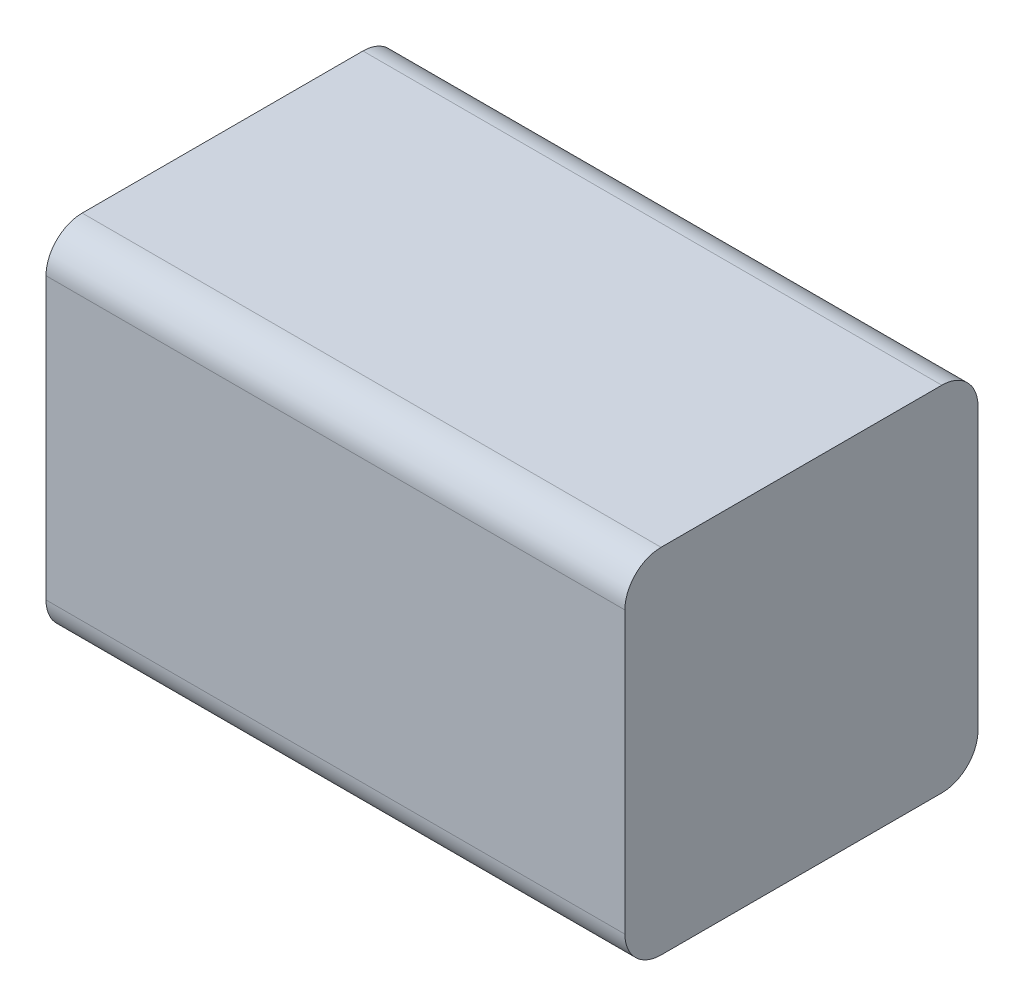
ISO-10303-21;
HEADER;
FILE_DESCRIPTION(('STEP AP214'),'2;1');
FILE_NAME('part.step','',(''),(''),'','','');
FILE_SCHEMA(('AUTOMOTIVE_DESIGN { 1 0 10303 214 1 1 1 1 }'));
ENDSEC;
DATA;
#1=APPLICATION_CONTEXT('core data for automotive mechanical design processes');
#2=APPLICATION_PROTOCOL_DEFINITION('international standard','automotive_design',2000,#1);
#3=PRODUCT_CONTEXT('',#1,'mechanical');
#4=PRODUCT('Part','Part','',(#3));
#5=PRODUCT_RELATED_PRODUCT_CATEGORY('part','',(#4));
#6=PRODUCT_DEFINITION_FORMATION('','',#4);
#7=PRODUCT_DEFINITION_CONTEXT('part definition',#1,'design');
#8=PRODUCT_DEFINITION('design','',#6,#7);
#9=PRODUCT_DEFINITION_SHAPE('','',#8);
#10=(LENGTH_UNIT() NAMED_UNIT(*) SI_UNIT(.MILLI.,.METRE.));
#11=(NAMED_UNIT(*) PLANE_ANGLE_UNIT() SI_UNIT($,.RADIAN.));
#12=(NAMED_UNIT(*) SI_UNIT($,.STERADIAN.) SOLID_ANGLE_UNIT());
#13=UNCERTAINTY_MEASURE_WITH_UNIT(LENGTH_MEASURE(1.E-05),#10,'distance_accuracy_value','');
#14=(GEOMETRIC_REPRESENTATION_CONTEXT(3) GLOBAL_UNCERTAINTY_ASSIGNED_CONTEXT((#13)) GLOBAL_UNIT_ASSIGNED_CONTEXT((#10,
#11,#12)) REPRESENTATION_CONTEXT('',''));
#15=CARTESIAN_POINT('',(0.,0.,0.));
#16=DIRECTION('',(0.,0.,1.));
#17=DIRECTION('',(1.,0.,0.));
#18=AXIS2_PLACEMENT_3D('',#15,#16,#17);
#19=CARTESIAN_POINT('',(-0.4,-0.194,0.458));
#20=DIRECTION('',(-1.,0.,0.));
#21=DIRECTION('',(0.,1.,0.));
#22=AXIS2_PLACEMENT_3D('',#19,#20,#21);
#23=CYLINDRICAL_SURFACE('',#22,0.05);
#24=CARTESIAN_POINT('',(-0.4,-0.194,0.458));
#25=DIRECTION('',(1.,0.,0.));
#26=DIRECTION('',(0.,1.,0.));
#27=AXIS2_PLACEMENT_3D('',#24,#25,#26);
#28=CIRCLE('',#27,0.05);
#29=CARTESIAN_POINT('',(-0.4,-0.19400000043,0.508));
#30=VERTEX_POINT('',#29);
#31=CARTESIAN_POINT('',(-0.4,-0.244,0.458));
#32=VERTEX_POINT('',#31);
#33=EDGE_CURVE('E141',#30,#32,#28,.T.);
#34=ORIENTED_EDGE('',*,*,#33,.T.);
#35=DIRECTION('',(1.,0.,0.));
#36=VECTOR('',#35,1.);
#37=CARTESIAN_POINT('',(-0.4,-0.244,0.458));
#38=LINE('',#37,#36);
#39=CARTESIAN_POINT('',(0.4,-0.244,0.458));
#40=VERTEX_POINT('',#39);
#41=EDGE_CURVE('E11',#32,#40,#38,.T.);
#42=ORIENTED_EDGE('',*,*,#41,.T.);
#43=CARTESIAN_POINT('',(0.4,-0.194,0.458));
#44=DIRECTION('',(1.,0.,0.));
#45=DIRECTION('',(0.,1.,0.));
#46=AXIS2_PLACEMENT_3D('',#43,#44,#45);
#47=CIRCLE('',#46,0.05);
#48=CARTESIAN_POINT('',(0.4,-0.19400000043,0.508));
#49=VERTEX_POINT('',#48);
#50=EDGE_CURVE('E137',#49,#40,#47,.T.);
#51=ORIENTED_EDGE('',*,*,#50,.F.);
#52=DIRECTION('',(1.,0.,0.));
#53=VECTOR('',#52,1.);
#54=CARTESIAN_POINT('',(-0.4,-0.19400000043,0.508));
#55=LINE('',#54,#53);
#56=EDGE_CURVE('E143',#30,#49,#55,.T.);
#57=ORIENTED_EDGE('',*,*,#56,.F.);
#58=EDGE_LOOP('',(#34,#42,#51,#57));
#59=FACE_BOUND('',#58,.T.);
#60=ADVANCED_FACE('F17',(#59),#23,.T.);
#61=CARTESIAN_POINT('',(-0.4,-0.244,0.458));
#62=DIRECTION('',(0.,1.,0.));
#63=DIRECTION('',(1.,0.,0.));
#64=AXIS2_PLACEMENT_3D('',#61,#62,#63);
#65=PLANE('',#64);
#66=DIRECTION('',(0.,0.,-1.));
#67=VECTOR('',#66,1.);
#68=CARTESIAN_POINT('',(-0.4,-0.244,0.458));
#69=LINE('',#68,#67);
#70=CARTESIAN_POINT('',(-0.4,-0.244,0.07));
#71=VERTEX_POINT('',#70);
#72=EDGE_CURVE('E144',#32,#71,#69,.T.);
#73=ORIENTED_EDGE('',*,*,#72,.T.);
#74=DIRECTION('',(1.,0.,0.));
#75=VECTOR('',#74,1.);
#76=CARTESIAN_POINT('',(-0.4,-0.244,0.07));
#77=LINE('',#76,#75);
#78=CARTESIAN_POINT('',(0.4,-0.244,0.07));
#79=VERTEX_POINT('',#78);
#80=EDGE_CURVE('E28',#71,#79,#77,.T.);
#81=ORIENTED_EDGE('',*,*,#80,.T.);
#82=DIRECTION('',(0.,0.,-1.));
#83=VECTOR('',#82,1.);
#84=CARTESIAN_POINT('',(0.4,-0.244,0.458));
#85=LINE('',#84,#83);
#86=EDGE_CURVE('E132',#40,#79,#85,.T.);
#87=ORIENTED_EDGE('',*,*,#86,.F.);
#88=ORIENTED_EDGE('',*,*,#41,.F.);
#89=EDGE_LOOP('',(#73,#81,#87,#88));
#90=FACE_BOUND('',#89,.T.);
#91=ADVANCED_FACE('F219',(#90),#65,.F.);
#92=CARTESIAN_POINT('',(-0.4,-0.194,0.07));
#93=DIRECTION('',(-1.,0.,0.));
#94=DIRECTION('',(0.,1.,0.));
#95=AXIS2_PLACEMENT_3D('',#92,#93,#94);
#96=CYLINDRICAL_SURFACE('',#95,0.05);
#97=CARTESIAN_POINT('',(-0.4,-0.194,0.07));
#98=DIRECTION('',(1.,0.,0.));
#99=DIRECTION('',(0.,1.,0.));
#100=AXIS2_PLACEMENT_3D('',#97,#98,#99);
#101=CIRCLE('',#100,0.05);
#102=CARTESIAN_POINT('',(-0.4,-0.19400000043,0.02));
#103=VERTEX_POINT('',#102);
#104=EDGE_CURVE('E21',#71,#103,#101,.T.);
#105=ORIENTED_EDGE('',*,*,#104,.T.);
#106=DIRECTION('',(1.,0.,0.));
#107=VECTOR('',#106,1.);
#108=CARTESIAN_POINT('',(-0.4,-0.19400000043,0.02));
#109=LINE('',#108,#107);
#110=CARTESIAN_POINT('',(0.4,-0.19400000043,0.02));
#111=VERTEX_POINT('',#110);
#112=EDGE_CURVE('E126',#103,#111,#109,.T.);
#113=ORIENTED_EDGE('',*,*,#112,.T.);
#114=CARTESIAN_POINT('',(0.4,-0.194,0.07));
#115=DIRECTION('',(1.,0.,0.));
#116=DIRECTION('',(0.,1.,0.));
#117=AXIS2_PLACEMENT_3D('',#114,#115,#116);
#118=CIRCLE('',#117,0.05);
#119=EDGE_CURVE('E136',#79,#111,#118,.T.);
#120=ORIENTED_EDGE('',*,*,#119,.F.);
#121=ORIENTED_EDGE('',*,*,#80,.F.);
#122=EDGE_LOOP('',(#105,#113,#120,#121));
#123=FACE_BOUND('',#122,.T.);
#124=ADVANCED_FACE('F223',(#123),#96,.T.);
#125=CARTESIAN_POINT('',(-0.4,0.19400000048,0.02));
#126=DIRECTION('',(0.,0.,-1.));
#127=DIRECTION('',(0.,-1.,0.));
#128=AXIS2_PLACEMENT_3D('',#125,#126,#127);
#129=PLANE('',#128);
#130=DIRECTION('',(1.,0.,0.));
#131=VECTOR('',#130,1.);
#132=CARTESIAN_POINT('',(-0.4,0.19400000048,0.02));
#133=LINE('',#132,#131);
#134=CARTESIAN_POINT('',(-0.4,0.19400000048,0.02));
#135=VERTEX_POINT('',#134);
#136=CARTESIAN_POINT('',(0.4,0.19400000048,0.02));
#137=VERTEX_POINT('',#136);
#138=EDGE_CURVE('E129',#135,#137,#133,.T.);
#139=ORIENTED_EDGE('',*,*,#138,.T.);
#140=DIRECTION('',(0.,-1.,0.));
#141=VECTOR('',#140,1.);
#142=CARTESIAN_POINT('',(0.4,0.19400000048,0.02));
#143=LINE('',#142,#141);
#144=EDGE_CURVE('E150',#137,#111,#143,.T.);
#145=ORIENTED_EDGE('',*,*,#144,.T.);
#146=ORIENTED_EDGE('',*,*,#112,.F.);
#147=DIRECTION('',(0.,-1.,0.));
#148=VECTOR('',#147,1.);
#149=CARTESIAN_POINT('',(-0.4,0.19400000048,0.02));
#150=LINE('',#149,#148);
#151=EDGE_CURVE('E165',#135,#103,#150,.T.);
#152=ORIENTED_EDGE('',*,*,#151,.F.);
#153=EDGE_LOOP('',(#139,#145,#146,#152));
#154=FACE_BOUND('',#153,.T.);
#155=ADVANCED_FACE('F193',(#154),#129,.T.);
#156=CARTESIAN_POINT('',(-0.4,0.19400000048,0.07));
#157=DIRECTION('',(-1.,0.,0.));
#158=DIRECTION('',(0.,1.,0.));
#159=AXIS2_PLACEMENT_3D('',#156,#157,#158);
#160=CYLINDRICAL_SURFACE('',#159,0.05);
#161=CARTESIAN_POINT('',(-0.4,0.19400000048,0.07));
#162=DIRECTION('',(1.,0.,0.));
#163=DIRECTION('',(0.,1.,0.));
#164=AXIS2_PLACEMENT_3D('',#161,#162,#163);
#165=CIRCLE('',#164,0.05);
#166=CARTESIAN_POINT('',(-0.4,0.24400000048,0.07));
#167=VERTEX_POINT('',#166);
#168=EDGE_CURVE('E111',#135,#167,#165,.T.);
#169=ORIENTED_EDGE('',*,*,#168,.T.);
#170=DIRECTION('',(1.,0.,0.));
#171=VECTOR('',#170,1.);
#172=CARTESIAN_POINT('',(-0.4,0.24400000048,0.07));
#173=LINE('',#172,#171);
#174=CARTESIAN_POINT('',(0.4,0.24400000048,0.07));
#175=VERTEX_POINT('',#174);
#176=EDGE_CURVE('E102',#167,#175,#173,.T.);
#177=ORIENTED_EDGE('',*,*,#176,.T.);
#178=CARTESIAN_POINT('',(0.4,0.19400000048,0.07));
#179=DIRECTION('',(1.,0.,0.));
#180=DIRECTION('',(0.,1.,0.));
#181=AXIS2_PLACEMENT_3D('',#178,#179,#180);
#182=CIRCLE('',#181,0.05);
#183=EDGE_CURVE('E146',#137,#175,#182,.T.);
#184=ORIENTED_EDGE('',*,*,#183,.F.);
#185=ORIENTED_EDGE('',*,*,#138,.F.);
#186=EDGE_LOOP('',(#169,#177,#184,#185));
#187=FACE_BOUND('',#186,.T.);
#188=ADVANCED_FACE('F185',(#187),#160,.T.);
#189=CARTESIAN_POINT('',(-0.4,0.244,0.458));
#190=DIRECTION('',(0.,1.,1.2373066E-09));
#191=DIRECTION('',(0.999999999999937,0.,-3.55611131468928E-07));
#192=AXIS2_PLACEMENT_3D('',#189,#190,#191);
#193=PLANE('',#192);
#194=DIRECTION('',(1.,0.,0.));
#195=VECTOR('',#194,1.);
#196=CARTESIAN_POINT('',(-0.4,0.244,0.458));
#197=LINE('',#196,#195);
#198=CARTESIAN_POINT('',(-0.4,0.244,0.458));
#199=VERTEX_POINT('',#198);
#200=CARTESIAN_POINT('',(0.4,0.244,0.458));
#201=VERTEX_POINT('',#200);
#202=EDGE_CURVE('E90',#199,#201,#197,.T.);
#203=ORIENTED_EDGE('',*,*,#202,.T.);
#204=DIRECTION('',(0.,1.23730705E-09,-1.));
#205=VECTOR('',#204,1.);
#206=CARTESIAN_POINT('',(0.4,0.244,0.458));
#207=LINE('',#206,#205);
#208=EDGE_CURVE('E149',#201,#175,#207,.T.);
#209=ORIENTED_EDGE('',*,*,#208,.T.);
#210=ORIENTED_EDGE('',*,*,#176,.F.);
#211=DIRECTION('',(0.,1.23730705E-09,-1.));
#212=VECTOR('',#211,1.);
#213=CARTESIAN_POINT('',(-0.4,0.244,0.458));
#214=LINE('',#213,#212);
#215=EDGE_CURVE('E106',#199,#167,#214,.T.);
#216=ORIENTED_EDGE('',*,*,#215,.F.);
#217=EDGE_LOOP('',(#203,#209,#210,#216));
#218=FACE_BOUND('',#217,.T.);
#219=ADVANCED_FACE('F19',(#218),#193,.T.);
#220=CARTESIAN_POINT('',(-0.4,0.194,0.458));
#221=DIRECTION('',(-1.,0.,0.));
#222=DIRECTION('',(0.,1.,0.));
#223=AXIS2_PLACEMENT_3D('',#220,#221,#222);
#224=CYLINDRICAL_SURFACE('',#223,0.05);
#225=CARTESIAN_POINT('',(-0.4,0.194,0.458));
#226=DIRECTION('',(1.,0.,0.));
#227=DIRECTION('',(0.,1.,0.));
#228=AXIS2_PLACEMENT_3D('',#225,#226,#227);
#229=CIRCLE('',#228,0.05);
#230=CARTESIAN_POINT('',(-0.4,0.19400000048,0.508));
#231=VERTEX_POINT('',#230);
#232=EDGE_CURVE('E94',#199,#231,#229,.T.);
#233=ORIENTED_EDGE('',*,*,#232,.T.);
#234=DIRECTION('',(1.,0.,0.));
#235=VECTOR('',#234,1.);
#236=CARTESIAN_POINT('',(-0.4,0.19400000048,0.508));
#237=LINE('',#236,#235);
#238=CARTESIAN_POINT('',(0.4,0.19400000048,0.508));
#239=VERTEX_POINT('',#238);
#240=EDGE_CURVE('E103',#231,#239,#237,.T.);
#241=ORIENTED_EDGE('',*,*,#240,.T.);
#242=CARTESIAN_POINT('',(0.4,0.194,0.458));
#243=DIRECTION('',(1.,0.,0.));
#244=DIRECTION('',(0.,1.,0.));
#245=AXIS2_PLACEMENT_3D('',#242,#243,#244);
#246=CIRCLE('',#245,0.05);
#247=EDGE_CURVE('E97',#201,#239,#246,.T.);
#248=ORIENTED_EDGE('',*,*,#247,.F.);
#249=ORIENTED_EDGE('',*,*,#202,.F.);
#250=EDGE_LOOP('',(#233,#241,#248,#249));
#251=FACE_BOUND('',#250,.T.);
#252=ADVANCED_FACE('F92',(#251),#224,.T.);
#253=CARTESIAN_POINT('',(-0.4,-0.19400000043,0.508));
#254=DIRECTION('',(0.,0.,1.));
#255=DIRECTION('',(0.,-1.,0.));
#256=AXIS2_PLACEMENT_3D('',#253,#254,#255);
#257=PLANE('',#256);
#258=ORIENTED_EDGE('',*,*,#56,.T.);
#259=DIRECTION('',(0.,1.,0.));
#260=VECTOR('',#259,1.);
#261=CARTESIAN_POINT('',(0.4,-0.19400000043,0.508));
#262=LINE('',#261,#260);
#263=EDGE_CURVE('E123',#49,#239,#262,.T.);
#264=ORIENTED_EDGE('',*,*,#263,.T.);
#265=ORIENTED_EDGE('',*,*,#240,.F.);
#266=DIRECTION('',(0.,1.,0.));
#267=VECTOR('',#266,1.);
#268=CARTESIAN_POINT('',(-0.4,-0.19400000043,0.508));
#269=LINE('',#268,#267);
#270=EDGE_CURVE('E116',#30,#231,#269,.T.);
#271=ORIENTED_EDGE('',*,*,#270,.F.);
#272=EDGE_LOOP('',(#258,#264,#265,#271));
#273=FACE_BOUND('',#272,.T.);
#274=ADVANCED_FACE('F245',(#273),#257,.T.);
#275=CARTESIAN_POINT('',(-0.4,1.1822767E-10,0.26399999994));
#276=DIRECTION('',(1.,0.,0.));
#277=DIRECTION('',(0.,-1.,0.));
#278=AXIS2_PLACEMENT_3D('',#275,#276,#277);
#279=PLANE('',#278);
#280=ORIENTED_EDGE('',*,*,#270,.T.);
#281=ORIENTED_EDGE('',*,*,#232,.F.);
#282=ORIENTED_EDGE('',*,*,#215,.T.);
#283=ORIENTED_EDGE('',*,*,#168,.F.);
#284=ORIENTED_EDGE('',*,*,#151,.T.);
#285=ORIENTED_EDGE('',*,*,#104,.F.);
#286=ORIENTED_EDGE('',*,*,#72,.F.);
#287=ORIENTED_EDGE('',*,*,#33,.F.);
#288=EDGE_LOOP('',(#280,#281,#282,#283,#284,#285,#286,#287));
#289=FACE_BOUND('',#288,.T.);
#290=ADVANCED_FACE('F113',(#289),#279,.F.);
#291=CARTESIAN_POINT('',(0.4,1.1822727E-10,0.26399999994));
#292=DIRECTION('',(1.,0.,0.));
#293=DIRECTION('',(0.,-1.,0.));
#294=AXIS2_PLACEMENT_3D('',#291,#292,#293);
#295=PLANE('',#294);
#296=ORIENTED_EDGE('',*,*,#50,.T.);
#297=ORIENTED_EDGE('',*,*,#86,.T.);
#298=ORIENTED_EDGE('',*,*,#119,.T.);
#299=ORIENTED_EDGE('',*,*,#144,.F.);
#300=ORIENTED_EDGE('',*,*,#183,.T.);
#301=ORIENTED_EDGE('',*,*,#208,.F.);
#302=ORIENTED_EDGE('',*,*,#247,.T.);
#303=ORIENTED_EDGE('',*,*,#263,.F.);
#304=EDGE_LOOP('',(#296,#297,#298,#299,#300,#301,#302,#303));
#305=FACE_BOUND('',#304,.T.);
#306=ADVANCED_FACE('F188',(#305),#295,.T.);
#307=CLOSED_SHELL('',(#60,#91,#124,#155,#188,#219,#252,#274,#290,#306));
#308=MANIFOLD_SOLID_BREP('B1',#307);
#309=ADVANCED_BREP_SHAPE_REPRESENTATION('',(#18,#308),#14);
#310=SHAPE_DEFINITION_REPRESENTATION(#9,#309);
ENDSEC;
END-ISO-10303-21;
